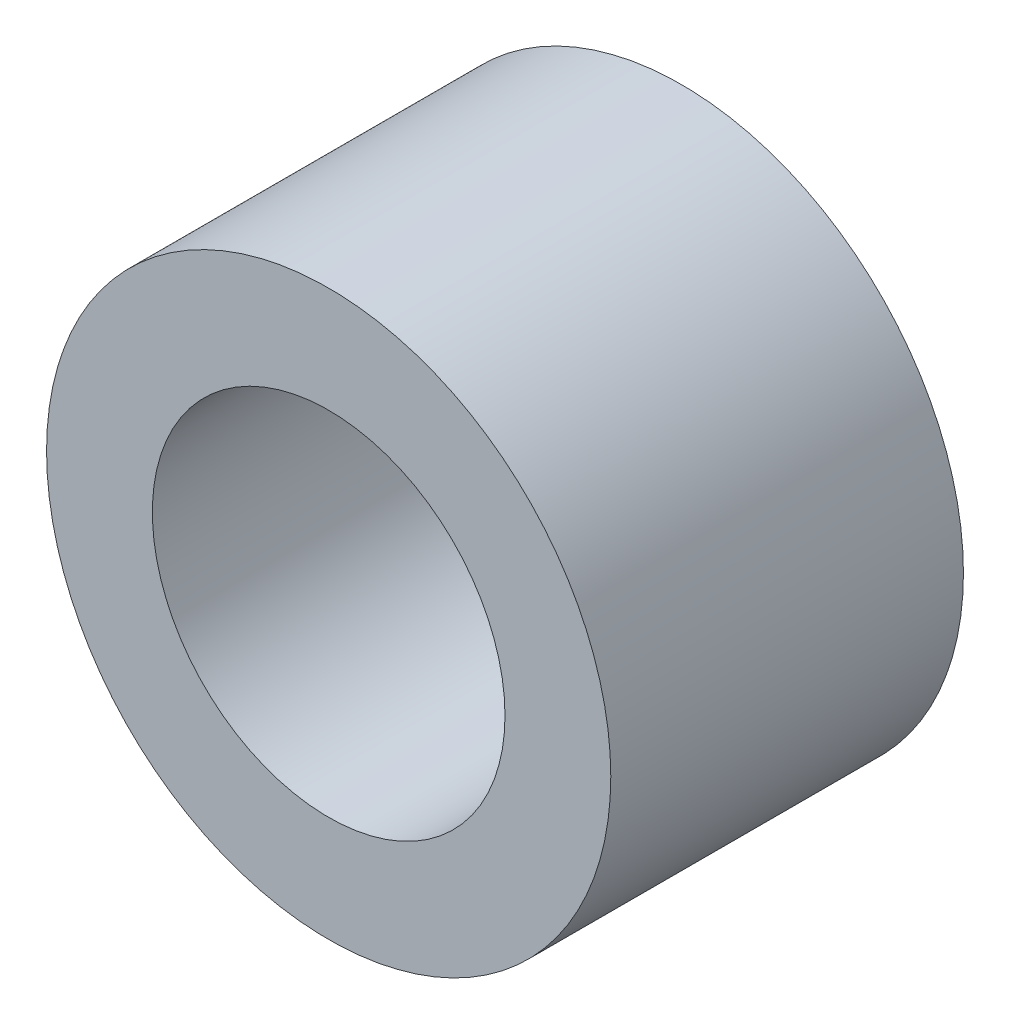
ISO-10303-21;
HEADER;
FILE_DESCRIPTION(('STEP AP214'),'2;1');
FILE_NAME('part.step','',(''),(''),'','','');
FILE_SCHEMA(('AUTOMOTIVE_DESIGN { 1 0 10303 214 1 1 1 1 }'));
ENDSEC;
DATA;
#1=APPLICATION_CONTEXT('core data for automotive mechanical design processes');
#2=APPLICATION_PROTOCOL_DEFINITION('international standard','automotive_design',2000,#1);
#3=PRODUCT_CONTEXT('',#1,'mechanical');
#4=PRODUCT('Part','Part','',(#3));
#5=PRODUCT_RELATED_PRODUCT_CATEGORY('part','',(#4));
#6=PRODUCT_DEFINITION_FORMATION('','',#4);
#7=PRODUCT_DEFINITION_CONTEXT('part definition',#1,'design');
#8=PRODUCT_DEFINITION('design','',#6,#7);
#9=PRODUCT_DEFINITION_SHAPE('','',#8);
#10=(LENGTH_UNIT() NAMED_UNIT(*) SI_UNIT(.MILLI.,.METRE.));
#11=(NAMED_UNIT(*) PLANE_ANGLE_UNIT() SI_UNIT($,.RADIAN.));
#12=(NAMED_UNIT(*) SI_UNIT($,.STERADIAN.) SOLID_ANGLE_UNIT());
#13=UNCERTAINTY_MEASURE_WITH_UNIT(LENGTH_MEASURE(1.E-05),#10,'distance_accuracy_value','');
#14=(GEOMETRIC_REPRESENTATION_CONTEXT(3) GLOBAL_UNCERTAINTY_ASSIGNED_CONTEXT((#13)) GLOBAL_UNIT_ASSIGNED_CONTEXT((#10,
#11,#12)) REPRESENTATION_CONTEXT('',''));
#15=CARTESIAN_POINT('',(0.,0.,0.));
#16=DIRECTION('',(0.,0.,1.));
#17=DIRECTION('',(1.,0.,0.));
#18=AXIS2_PLACEMENT_3D('',#15,#16,#17);
#19=CARTESIAN_POINT('',(0.,0.,7.9375));
#20=DIRECTION('',(0.,0.,1.));
#21=DIRECTION('',(1.,0.,0.));
#22=AXIS2_PLACEMENT_3D('',#19,#20,#21);
#23=PLANE('',#22);
#24=CARTESIAN_POINT('',(0.,0.,7.9375));
#25=DIRECTION('',(0.,0.,1.));
#26=DIRECTION('',(1.,0.,0.));
#27=AXIS2_PLACEMENT_3D('',#24,#25,#26);
#28=CIRCLE('',#27,12.7);
#29=CARTESIAN_POINT('',(12.7,0.,7.9375));
#30=VERTEX_POINT('',#29);
#31=EDGE_CURVE('E10',#30,#30,#28,.T.);
#32=ORIENTED_EDGE('',*,*,#31,.T.);
#33=EDGE_LOOP('',(#32));
#34=FACE_BOUND('',#33,.T.);
#35=CARTESIAN_POINT('',(0.,0.,7.9375));
#36=DIRECTION('',(0.,0.,1.));
#37=DIRECTION('',(1.,0.,0.));
#38=AXIS2_PLACEMENT_3D('',#35,#36,#37);
#39=CIRCLE('',#38,7.9375);
#40=CARTESIAN_POINT('',(7.9375,0.,7.9375));
#41=VERTEX_POINT('',#40);
#42=EDGE_CURVE('E42',#41,#41,#39,.T.);
#43=ORIENTED_EDGE('',*,*,#42,.F.);
#44=EDGE_LOOP('',(#43));
#45=FACE_BOUND('',#44,.T.);
#46=ADVANCED_FACE('F31',(#34,#45),#23,.T.);
#47=CARTESIAN_POINT('',(0.,0.,-7.9375));
#48=DIRECTION('',(0.,0.,1.));
#49=DIRECTION('',(1.,0.,0.));
#50=AXIS2_PLACEMENT_3D('',#47,#48,#49);
#51=PLANE('',#50);
#52=CARTESIAN_POINT('',(0.,0.,-7.9375));
#53=DIRECTION('',(0.,0.,1.));
#54=DIRECTION('',(1.,0.,0.));
#55=AXIS2_PLACEMENT_3D('',#52,#53,#54);
#56=CIRCLE('',#55,12.7);
#57=CARTESIAN_POINT('',(12.7,0.,-7.9375));
#58=VERTEX_POINT('',#57);
#59=EDGE_CURVE('E35',#58,#58,#56,.T.);
#60=ORIENTED_EDGE('',*,*,#59,.F.);
#61=EDGE_LOOP('',(#60));
#62=FACE_BOUND('',#61,.T.);
#63=CARTESIAN_POINT('',(0.,0.,-7.9375));
#64=DIRECTION('',(0.,0.,1.));
#65=DIRECTION('',(1.,0.,0.));
#66=AXIS2_PLACEMENT_3D('',#63,#64,#65);
#67=CIRCLE('',#66,7.9375);
#68=CARTESIAN_POINT('',(7.9375,0.,-7.9375));
#69=VERTEX_POINT('',#68);
#70=EDGE_CURVE('E44',#69,#69,#67,.T.);
#71=ORIENTED_EDGE('',*,*,#70,.T.);
#72=EDGE_LOOP('',(#71));
#73=FACE_BOUND('',#72,.T.);
#74=ADVANCED_FACE('F54',(#62,#73),#51,.F.);
#75=CARTESIAN_POINT('',(0.,0.,7.9375));
#76=DIRECTION('',(0.,0.,-1.));
#77=DIRECTION('',(-1.,0.,0.));
#78=AXIS2_PLACEMENT_3D('',#75,#76,#77);
#79=CYLINDRICAL_SURFACE('',#78,12.7);
#80=ORIENTED_EDGE('',*,*,#31,.F.);
#81=EDGE_LOOP('',(#80));
#82=FACE_BOUND('',#81,.T.);
#83=ORIENTED_EDGE('',*,*,#59,.T.);
#84=EDGE_LOOP('',(#83));
#85=FACE_BOUND('',#84,.T.);
#86=ADVANCED_FACE('F33',(#82,#85),#79,.T.);
#87=CARTESIAN_POINT('',(0.,0.,7.9375));
#88=DIRECTION('',(0.,0.,-1.));
#89=DIRECTION('',(-1.,0.,0.));
#90=AXIS2_PLACEMENT_3D('',#87,#88,#89);
#91=CYLINDRICAL_SURFACE('',#90,7.9375);
#92=ORIENTED_EDGE('',*,*,#42,.T.);
#93=EDGE_LOOP('',(#92));
#94=FACE_BOUND('',#93,.T.);
#95=ORIENTED_EDGE('',*,*,#70,.F.);
#96=EDGE_LOOP('',(#95));
#97=FACE_BOUND('',#96,.T.);
#98=ADVANCED_FACE('F50',(#94,#97),#91,.F.);
#99=CLOSED_SHELL('',(#46,#74,#86,#98));
#100=MANIFOLD_SOLID_BREP('B2',#99);
#101=ADVANCED_BREP_SHAPE_REPRESENTATION('',(#18,#100),#14);
#102=SHAPE_DEFINITION_REPRESENTATION(#9,#101);
ENDSEC;
END-ISO-10303-21;
